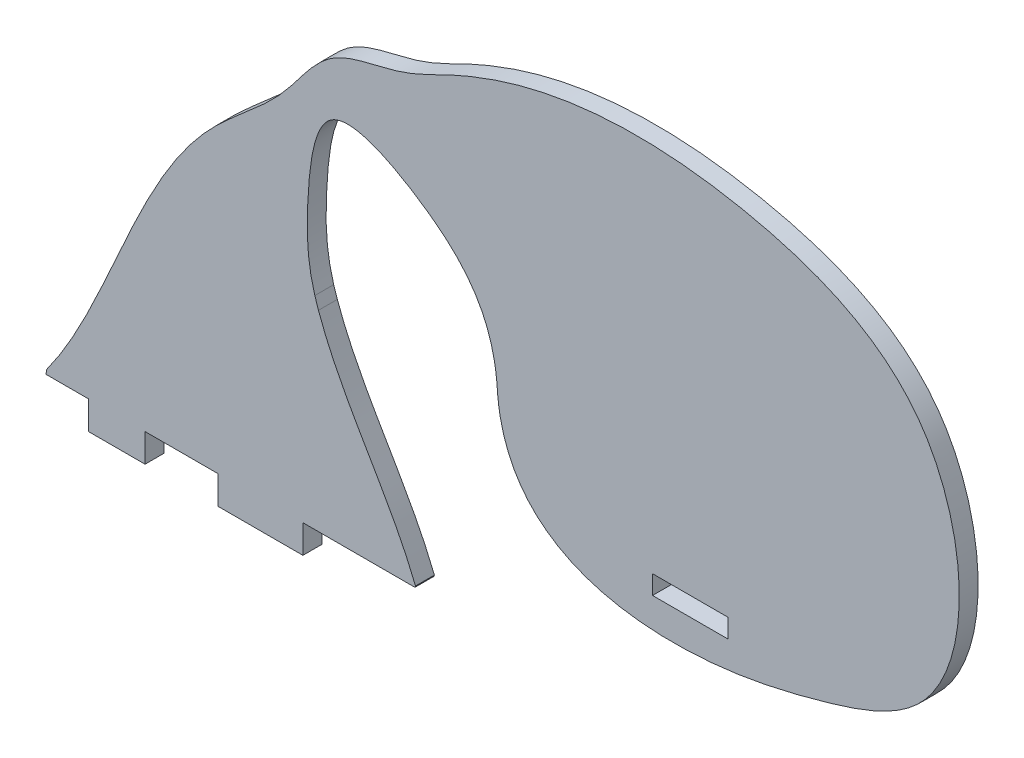
ISO-10303-21;
HEADER;
FILE_DESCRIPTION(('STEP AP214'),'2;1');
FILE_NAME('part.step','',(''),(''),'','','');
FILE_SCHEMA(('AUTOMOTIVE_DESIGN { 1 0 10303 214 1 1 1 1 }'));
ENDSEC;
DATA;
#1=APPLICATION_CONTEXT('core data for automotive mechanical design processes');
#2=APPLICATION_PROTOCOL_DEFINITION('international standard','automotive_design',2000,#1);
#3=PRODUCT_CONTEXT('',#1,'mechanical');
#4=PRODUCT('Part','Part','',(#3));
#5=PRODUCT_RELATED_PRODUCT_CATEGORY('part','',(#4));
#6=PRODUCT_DEFINITION_FORMATION('','',#4);
#7=PRODUCT_DEFINITION_CONTEXT('part definition',#1,'design');
#8=PRODUCT_DEFINITION('design','',#6,#7);
#9=PRODUCT_DEFINITION_SHAPE('','',#8);
#10=(LENGTH_UNIT() NAMED_UNIT(*) SI_UNIT(.MILLI.,.METRE.));
#11=(NAMED_UNIT(*) PLANE_ANGLE_UNIT() SI_UNIT($,.RADIAN.));
#12=(NAMED_UNIT(*) SI_UNIT($,.STERADIAN.) SOLID_ANGLE_UNIT());
#13=UNCERTAINTY_MEASURE_WITH_UNIT(LENGTH_MEASURE(1.E-05),#10,'distance_accuracy_value','');
#14=(GEOMETRIC_REPRESENTATION_CONTEXT(3) GLOBAL_UNCERTAINTY_ASSIGNED_CONTEXT((#13)) GLOBAL_UNIT_ASSIGNED_CONTEXT((#10,
#11,#12)) REPRESENTATION_CONTEXT('',''));
#15=CARTESIAN_POINT('',(0.,0.,0.));
#16=DIRECTION('',(0.,0.,1.));
#17=DIRECTION('',(1.,0.,0.));
#18=AXIS2_PLACEMENT_3D('',#15,#16,#17);
#19=CARTESIAN_POINT('',(151.643041852703,30.245831900639,3.70416970530882));
#20=DIRECTION('',(0.,0.,-1.));
#21=DIRECTION('',(-1.,0.,0.));
#22=AXIS2_PLACEMENT_3D('',#19,#20,#21);
#23=PLANE('',#22);
#24=DIRECTION('',(1.,0.,0.));
#25=VECTOR('',#24,1.);
#26=CARTESIAN_POINT('',(114.448695073066,14.0692116011259,3.70416970530882));
#27=LINE('',#26,#25);
#28=CARTESIAN_POINT('',(114.448695073066,14.0692116011259,3.70416970530882));
#29=VERTEX_POINT('',#28);
#30=CARTESIAN_POINT('',(126.718412539742,14.0692116011259,3.70416970530882));
#31=VERTEX_POINT('',#30);
#32=EDGE_CURVE('E202',#29,#31,#27,.T.);
#33=ORIENTED_EDGE('',*,*,#32,.T.);
#34=DIRECTION('',(0.,-1.,0.));
#35=VECTOR('',#34,1.);
#36=CARTESIAN_POINT('',(126.718412539742,14.0692116011259,3.70416970530882));
#37=LINE('',#36,#35);
#38=CARTESIAN_POINT('',(126.718412539742,9.30671160112593,3.70416970530882));
#39=VERTEX_POINT('',#38);
#40=EDGE_CURVE('E205',#31,#39,#37,.T.);
#41=ORIENTED_EDGE('',*,*,#40,.T.);
#42=DIRECTION('',(1.,0.,0.));
#43=VECTOR('',#42,1.);
#44=CARTESIAN_POINT('',(126.718412539742,9.30671160112593,3.70416970530882));
#45=LINE('',#44,#43);
#46=CARTESIAN_POINT('',(141.005912539742,9.30671160112593,3.70416970530882));
#47=VERTEX_POINT('',#46);
#48=EDGE_CURVE('E208',#39,#47,#45,.T.);
#49=ORIENTED_EDGE('',*,*,#48,.T.);
#50=DIRECTION('',(0.,-1.,0.));
#51=VECTOR('',#50,1.);
#52=CARTESIAN_POINT('',(141.005912539742,14.0692116011253,3.70416970530882));
#53=LINE('',#52,#51);
#54=CARTESIAN_POINT('',(141.005912539742,14.0692116011253,3.70416970530882));
#55=VERTEX_POINT('',#54);
#56=EDGE_CURVE('E210',#55,#47,#53,.T.);
#57=ORIENTED_EDGE('',*,*,#56,.F.);
#58=DIRECTION('',(1.,0.,0.));
#59=VECTOR('',#58,1.);
#60=CARTESIAN_POINT('',(141.005912539742,14.0692116011253,3.70416970530882));
#61=LINE('',#60,#59);
#62=CARTESIAN_POINT('',(159.85715335099,14.0692116011259,3.70416970530882));
#63=VERTEX_POINT('',#62);
#64=EDGE_CURVE('E213',#55,#63,#61,.T.);
#65=ORIENTED_EDGE('',*,*,#64,.T.);
#66=DIRECTION('',(-0.373907961816489,-0.927465813973884,0.));
#67=VECTOR('',#66,1.);
#68=CARTESIAN_POINT('',(159.95759326667,14.3183493506904,3.70416970530882));
#69=LINE('',#68,#67);
#70=CARTESIAN_POINT('',(159.95759326667,14.3183493506904,3.70416970530882));
#71=VERTEX_POINT('',#70);
#72=EDGE_CURVE('E215',#71,#63,#69,.T.);
#73=ORIENTED_EDGE('',*,*,#72,.F.);
#74=CARTESIAN_POINT('',(159.95759326667,14.3183493506904,3.70416970530882));
#75=CARTESIAN_POINT('',(158.650651564647,17.6074449729605,3.70416970530882));
#76=CARTESIAN_POINT('',(155.504316593502,23.777156125624,3.70416970530882));
#77=CARTESIAN_POINT('',(149.323091841887,34.0580293710669,3.70416970530882));
#78=CARTESIAN_POINT('',(145.335663883867,41.5169416765733,3.70416970530882));
#79=CARTESIAN_POINT('',(143.626220332458,46.3267811934756,3.70416970530882));
#80=B_SPLINE_CURVE_WITH_KNOTS('',3,(#74,#75,#76,#77,#78,#79),.UNSPECIFIED.,.F.,.F.,(4,1,1,4),
(0.00717720783399462,0.291773495549775,0.567265053776117,0.97597761351628),.UNSPECIFIED.);
#81=CARTESIAN_POINT('',(143.626220332458,46.3267811934756,3.70416970530882));
#82=VERTEX_POINT('',#81);
#83=EDGE_CURVE('E218',#71,#82,#80,.T.);
#84=ORIENTED_EDGE('',*,*,#83,.T.);
#85=DIRECTION('',(-0.313969115967202,0.949433196290699,0.));
#86=VECTOR('',#85,1.);
#87=CARTESIAN_POINT('',(143.626220332458,46.3267811934756,3.70416970530882));
#88=LINE('',#87,#86);
#89=CARTESIAN_POINT('',(143.016251875612,48.1713075247849,3.70416970530882));
#90=VERTEX_POINT('',#89);
#91=EDGE_CURVE('E223',#82,#90,#88,.T.);
#92=ORIENTED_EDGE('',*,*,#91,.T.);
#93=CARTESIAN_POINT('',(143.016251875612,48.1713075247849,3.70416970530882));
#94=CARTESIAN_POINT('',(142.822162635619,48.8181766287231,3.70416970530882));
#95=CARTESIAN_POINT('',(141.648808489398,53.2496699043366,3.70416970530882));
#96=CARTESIAN_POINT('',(141.5518085589,62.1692172422673,3.70416970530882));
#97=CARTESIAN_POINT('',(143.74990628341,79.9076641607131,3.70416970530882));
#98=CARTESIAN_POINT('',(162.59082079936,70.746647232209,3.70416970530882));
#99=CARTESIAN_POINT('',(171.595089106248,61.790980327002,3.70416970530882));
#100=CARTESIAN_POINT('',(173.420857888494,53.1661321395393,3.70416970530882));
#101=CARTESIAN_POINT('',(173.635098504375,50.9744813258842,3.70416970530882));
#102=B_SPLINE_CURVE_WITH_KNOTS('',3,(#93,#94,#95,#96,#97,#98,#99,#100,#101),.UNSPECIFIED.,.F.,
.F.,(4,1,1,1,1,1,4),(0.264994689383064,0.279802377306264,0.365863399168879,0.45947757732539,
0.562318617098575,0.686929258428295,0.728579137973158),.UNSPECIFIED.);
#103=CARTESIAN_POINT('',(173.635098504375,50.9744813258842,3.70416970530882));
#104=VERTEX_POINT('',#103);
#105=EDGE_CURVE('E565',#90,#104,#102,.T.);
#106=ORIENTED_EDGE('',*,*,#105,.T.);
#107=DIRECTION('',(0.0785114364288763,-0.996913213048094,0.));
#108=VECTOR('',#107,1.);
#109=CARTESIAN_POINT('',(173.635098504375,50.9744813258842,3.70416970530882));
#110=LINE('',#109,#108);
#111=CARTESIAN_POINT('',(173.784835939863,49.0731630630177,3.70416970530882));
#112=VERTEX_POINT('',#111);
#113=EDGE_CURVE('E305',#104,#112,#110,.T.);
#114=ORIENTED_EDGE('',*,*,#113,.T.);
#115=CARTESIAN_POINT('',(97.8805979648672,14.8287965823009,3.70416970530882));
#116=CARTESIAN_POINT('',(103.171392040852,22.0769220326136,3.70416970530882));
#117=CARTESIAN_POINT('',(110.743028890668,40.17936613296,3.70416970530882));
#118=CARTESIAN_POINT('',(121.831282137179,62.5339163119192,3.70416970530882));
#119=CARTESIAN_POINT('',(137.642229051947,73.4604378392573,3.70416970530882));
#120=CARTESIAN_POINT('',(144.896406532219,85.9295711572487,3.70416970530882));
#121=CARTESIAN_POINT('',(156.917499586568,87.0378645227915,3.70416970530882));
#122=CARTESIAN_POINT('',(167.256089322888,92.7135442838898,3.70416970530882));
#123=CARTESIAN_POINT('',(186.423895387685,99.4919003240907,3.70416970530882));
#124=CARTESIAN_POINT('',(215.106199634834,98.923746773354,3.70416970530882));
#125=CARTESIAN_POINT('',(252.420741019095,84.2929110402192,3.70416970530882));
#126=CARTESIAN_POINT('',(254.406057176904,40.0563334543786,3.70416970530882));
#127=CARTESIAN_POINT('',(227.775384830662,31.2343068957348,3.70416970530882));
#128=CARTESIAN_POINT('',(207.822602168201,26.7541932086652,3.70416970530882));
#129=CARTESIAN_POINT('',(183.427343698307,28.4276051629488,3.70416970530882));
#130=CARTESIAN_POINT('',(174.534272798024,40.8262523912298,3.70416970530882));
#131=CARTESIAN_POINT('',(173.784835939863,49.0731630630177,3.70416970530882));
#132=B_SPLINE_CURVE_WITH_KNOTS('',3,(#115,#116,#117,#118,#119,#120,#121,#122,#123,#124,#125,
#126,#127,#128,#129,#130,#131),.UNSPECIFIED.,.F.,.F.,(4,1,1,1,1,1,1,1,1,1,1,1,1,1,4),
(0.00311729559504195,0.0916383178119475,0.183567266396315,0.233931118152205,0.272247454898407,
0.310816901457849,0.339522035367532,0.384499820133369,0.501556462389772,0.607372289843828,
0.734505938126589,0.792568087540492,0.852746693519389,0.93592405260189,0.997824788650368),.UNSPECIFIED.);
#133=CARTESIAN_POINT('',(97.8805979648672,14.8287965823009,3.70416970530882));
#134=VERTEX_POINT('',#133);
#135=EDGE_CURVE('E297',#134,#112,#132,.T.);
#136=ORIENTED_EDGE('',*,*,#135,.F.);
#137=DIRECTION('',(-0.131362101592819,-0.991334453282603,0.));
#138=VECTOR('',#137,1.);
#139=CARTESIAN_POINT('',(97.8805979648672,14.8287965823009,3.70416970530882));
#140=LINE('',#139,#138);
#141=CARTESIAN_POINT('',(97.7799450730656,14.0692116011259,3.70416970530882));
#142=VERTEX_POINT('',#141);
#143=EDGE_CURVE('E304',#134,#142,#140,.T.);
#144=ORIENTED_EDGE('',*,*,#143,.T.);
#145=DIRECTION('',(1.,0.,0.));
#146=VECTOR('',#145,1.);
#147=CARTESIAN_POINT('',(97.7799450730656,14.0692116011259,3.70416970530882));
#148=LINE('',#147,#146);
#149=CARTESIAN_POINT('',(104.923695073066,14.0692116011259,3.70416970530882));
#150=VERTEX_POINT('',#149);
#151=EDGE_CURVE('E310',#142,#150,#148,.T.);
#152=ORIENTED_EDGE('',*,*,#151,.T.);
#153=DIRECTION('',(0.,-1.,0.));
#154=VECTOR('',#153,1.);
#155=CARTESIAN_POINT('',(104.923695073066,14.0692116011259,3.70416970530882));
#156=LINE('',#155,#154);
#157=CARTESIAN_POINT('',(104.923695073066,9.30671160112593,3.70416970530882));
#158=VERTEX_POINT('',#157);
#159=EDGE_CURVE('E312',#150,#158,#156,.T.);
#160=ORIENTED_EDGE('',*,*,#159,.T.);
#161=DIRECTION('',(1.,0.,0.));
#162=VECTOR('',#161,1.);
#163=CARTESIAN_POINT('',(104.923695073066,9.30671160112593,3.70416970530882));
#164=LINE('',#163,#162);
#165=CARTESIAN_POINT('',(114.448695073066,9.30671160112593,3.70416970530882));
#166=VERTEX_POINT('',#165);
#167=EDGE_CURVE('E314',#158,#166,#164,.T.);
#168=ORIENTED_EDGE('',*,*,#167,.T.);
#169=DIRECTION('',(0.,-1.,0.));
#170=VECTOR('',#169,1.);
#171=CARTESIAN_POINT('',(114.448695073066,14.0692116011259,3.70416970530882));
#172=LINE('',#171,#170);
#173=EDGE_CURVE('E316',#29,#166,#172,.T.);
#174=ORIENTED_EDGE('',*,*,#173,.F.);
#175=EDGE_LOOP('',(#33,#41,#49,#57,#65,#73,#84,#92,#106,#114,#136,#144,#152,#160,#168,#174));
#176=FACE_BOUND('',#175,.T.);
#177=DIRECTION('',(0.,1.,0.));
#178=VECTOR('',#177,1.);
#179=CARTESIAN_POINT('',(212.537737342942,32.8767266461979,3.7041697053088));
#180=LINE('',#179,#178);
#181=CARTESIAN_POINT('',(212.537737342942,32.8767266461979,3.7041697053088));
#182=VERTEX_POINT('',#181);
#183=CARTESIAN_POINT('',(212.537737342942,36.0517266461979,3.7041697053088));
#184=VERTEX_POINT('',#183);
#185=EDGE_CURVE('E189',#182,#184,#180,.T.);
#186=ORIENTED_EDGE('',*,*,#185,.F.);
#187=DIRECTION('',(-1.,0.,0.));
#188=VECTOR('',#187,1.);
#189=CARTESIAN_POINT('',(228.412737342942,32.8767266461979,3.7041697053088));
#190=LINE('',#189,#188);
#191=CARTESIAN_POINT('',(199.837737342942,32.8767266461979,3.7041697053088));
#192=VERTEX_POINT('',#191);
#193=EDGE_CURVE('E193',#182,#192,#190,.T.);
#194=ORIENTED_EDGE('',*,*,#193,.T.);
#195=DIRECTION('',(0.,1.,0.));
#196=VECTOR('',#195,1.);
#197=CARTESIAN_POINT('',(199.837737342942,32.8767266461979,3.70416970530882));
#198=LINE('',#197,#196);
#199=CARTESIAN_POINT('',(199.837737342942,36.0517266461979,3.70416970530882));
#200=VERTEX_POINT('',#199);
#201=EDGE_CURVE('E178',#192,#200,#198,.T.);
#202=ORIENTED_EDGE('',*,*,#201,.T.);
#203=DIRECTION('',(-1.,0.,0.));
#204=VECTOR('',#203,1.);
#205=CARTESIAN_POINT('',(228.412737342942,36.0517266461979,3.7041697053088));
#206=LINE('',#205,#204);
#207=EDGE_CURVE('E50',#184,#200,#206,.T.);
#208=ORIENTED_EDGE('',*,*,#207,.F.);
#209=EDGE_LOOP('',(#186,#194,#202,#208));
#210=FACE_BOUND('',#209,.T.);
#211=ADVANCED_FACE('F35',(#176,#210),#23,.F.);
#212=CARTESIAN_POINT('',(114.448695073066,14.0692116011259,3.70416970530882));
#213=DIRECTION('',(0.,1.,0.));
#214=DIRECTION('',(-1.,0.,0.));
#215=AXIS2_PLACEMENT_3D('',#212,#213,#214);
#216=PLANE('',#215);
#217=DIRECTION('',(1.,0.,0.));
#218=VECTOR('',#217,1.);
#219=CARTESIAN_POINT('',(114.448695073066,14.0692116011259,0.529169705308823));
#220=LINE('',#219,#218);
#221=CARTESIAN_POINT('',(114.448695073066,14.0692116011259,0.529169705308823));
#222=VERTEX_POINT('',#221);
#223=CARTESIAN_POINT('',(126.718412539742,14.0692116011259,0.529169705308823));
#224=VERTEX_POINT('',#223);
#225=EDGE_CURVE('E201',#222,#224,#220,.T.);
#226=ORIENTED_EDGE('',*,*,#225,.T.);
#227=DIRECTION('',(0.,0.,-1.));
#228=VECTOR('',#227,1.);
#229=CARTESIAN_POINT('',(126.718412539742,14.0692116011259,3.70416970530882));
#230=LINE('',#229,#228);
#231=EDGE_CURVE('E410',#31,#224,#230,.T.);
#232=ORIENTED_EDGE('',*,*,#231,.F.);
#233=ORIENTED_EDGE('',*,*,#32,.F.);
#234=DIRECTION('',(0.,0.,-1.));
#235=VECTOR('',#234,1.);
#236=CARTESIAN_POINT('',(114.448695073066,14.0692116011259,3.70416970530882));
#237=LINE('',#236,#235);
#238=EDGE_CURVE('E319',#29,#222,#237,.T.);
#239=ORIENTED_EDGE('',*,*,#238,.T.);
#240=EDGE_LOOP('',(#226,#232,#233,#239));
#241=FACE_BOUND('',#240,.T.);
#242=ADVANCED_FACE('F37',(#241),#216,.F.);
#243=CARTESIAN_POINT('',(126.718412539742,14.0692116011259,3.70416970530882));
#244=DIRECTION('',(1.,0.,0.));
#245=DIRECTION('',(0.,0.,-1.));
#246=AXIS2_PLACEMENT_3D('',#243,#244,#245);
#247=PLANE('',#246);
#248=DIRECTION('',(0.,-1.,0.));
#249=VECTOR('',#248,1.);
#250=CARTESIAN_POINT('',(126.718412539742,14.0692116011259,0.529169705308823));
#251=LINE('',#250,#249);
#252=CARTESIAN_POINT('',(126.718412539742,9.30671160112593,0.529169705308823));
#253=VERTEX_POINT('',#252);
#254=EDGE_CURVE('E322',#224,#253,#251,.T.);
#255=ORIENTED_EDGE('',*,*,#254,.T.);
#256=DIRECTION('',(0.,0.,-1.));
#257=VECTOR('',#256,1.);
#258=CARTESIAN_POINT('',(126.718412539742,9.30671160112593,3.70416970530882));
#259=LINE('',#258,#257);
#260=EDGE_CURVE('E407',#39,#253,#259,.T.);
#261=ORIENTED_EDGE('',*,*,#260,.F.);
#262=ORIENTED_EDGE('',*,*,#40,.F.);
#263=ORIENTED_EDGE('',*,*,#231,.T.);
#264=EDGE_LOOP('',(#255,#261,#262,#263));
#265=FACE_BOUND('',#264,.T.);
#266=ADVANCED_FACE('F250',(#265),#247,.F.);
#267=CARTESIAN_POINT('',(126.718412539742,9.30671160112593,3.70416970530882));
#268=DIRECTION('',(0.,1.,0.));
#269=DIRECTION('',(0.,0.,1.));
#270=AXIS2_PLACEMENT_3D('',#267,#268,#269);
#271=PLANE('',#270);
#272=DIRECTION('',(1.,0.,0.));
#273=VECTOR('',#272,1.);
#274=CARTESIAN_POINT('',(126.718412539742,9.30671160112593,0.529169705308823));
#275=LINE('',#274,#273);
#276=CARTESIAN_POINT('',(141.005912539742,9.30671160112593,0.529169705308823));
#277=VERTEX_POINT('',#276);
#278=EDGE_CURVE('E324',#253,#277,#275,.T.);
#279=ORIENTED_EDGE('',*,*,#278,.T.);
#280=DIRECTION('',(0.,0.,-1.));
#281=VECTOR('',#280,1.);
#282=CARTESIAN_POINT('',(141.005912539742,9.30671160112593,3.70416970530882));
#283=LINE('',#282,#281);
#284=EDGE_CURVE('E405',#47,#277,#283,.T.);
#285=ORIENTED_EDGE('',*,*,#284,.F.);
#286=ORIENTED_EDGE('',*,*,#48,.F.);
#287=ORIENTED_EDGE('',*,*,#260,.T.);
#288=EDGE_LOOP('',(#279,#285,#286,#287));
#289=FACE_BOUND('',#288,.T.);
#290=ADVANCED_FACE('F247',(#289),#271,.F.);
#291=CARTESIAN_POINT('',(141.005912539742,14.0692116011253,3.70416970530882));
#292=DIRECTION('',(1.,0.,0.));
#293=DIRECTION('',(0.,0.,-1.));
#294=AXIS2_PLACEMENT_3D('',#291,#292,#293);
#295=PLANE('',#294);
#296=DIRECTION('',(0.,-1.,0.));
#297=VECTOR('',#296,1.);
#298=CARTESIAN_POINT('',(141.005912539742,14.0692116011253,0.529169705308823));
#299=LINE('',#298,#297);
#300=CARTESIAN_POINT('',(141.005912539742,14.0692116011253,0.529169705308823));
#301=VERTEX_POINT('',#300);
#302=EDGE_CURVE('E327',#301,#277,#299,.T.);
#303=ORIENTED_EDGE('',*,*,#302,.F.);
#304=DIRECTION('',(0.,0.,-1.));
#305=VECTOR('',#304,1.);
#306=CARTESIAN_POINT('',(141.005912539742,14.0692116011253,3.70416970530882));
#307=LINE('',#306,#305);
#308=EDGE_CURVE('E403',#55,#301,#307,.T.);
#309=ORIENTED_EDGE('',*,*,#308,.F.);
#310=ORIENTED_EDGE('',*,*,#56,.T.);
#311=ORIENTED_EDGE('',*,*,#284,.T.);
#312=EDGE_LOOP('',(#303,#309,#310,#311));
#313=FACE_BOUND('',#312,.T.);
#314=ADVANCED_FACE('F243',(#313),#295,.T.);
#315=CARTESIAN_POINT('',(141.005912539742,14.0692116011253,3.70416970530882));
#316=DIRECTION('',(0.,1.,0.));
#317=DIRECTION('',(-1.,0.,0.));
#318=AXIS2_PLACEMENT_3D('',#315,#316,#317);
#319=PLANE('',#318);
#320=DIRECTION('',(1.,0.,0.));
#321=VECTOR('',#320,1.);
#322=CARTESIAN_POINT('',(141.005912539742,14.0692116011253,0.529169705308823));
#323=LINE('',#322,#321);
#324=CARTESIAN_POINT('',(159.85715335099,14.0692116011259,0.529169705308823));
#325=VERTEX_POINT('',#324);
#326=EDGE_CURVE('E330',#301,#325,#323,.T.);
#327=ORIENTED_EDGE('',*,*,#326,.T.);
#328=DIRECTION('',(0.,0.,-1.));
#329=VECTOR('',#328,1.);
#330=CARTESIAN_POINT('',(159.85715335099,14.0692116011259,3.70416970530882));
#331=LINE('',#330,#329);
#332=EDGE_CURVE('E401',#63,#325,#331,.T.);
#333=ORIENTED_EDGE('',*,*,#332,.F.);
#334=ORIENTED_EDGE('',*,*,#64,.F.);
#335=ORIENTED_EDGE('',*,*,#308,.T.);
#336=EDGE_LOOP('',(#327,#333,#334,#335));
#337=FACE_BOUND('',#336,.T.);
#338=ADVANCED_FACE('F239',(#337),#319,.F.);
#339=CARTESIAN_POINT('',(159.95759326667,14.3183493506904,3.70416970530882));
#340=DIRECTION('',(0.927465813973884,-0.373907961816489,0.));
#341=DIRECTION('',(0.373907961816489,0.927465813973884,0.));
#342=AXIS2_PLACEMENT_3D('',#339,#340,#341);
#343=PLANE('',#342);
#344=DIRECTION('',(-0.373907961816489,-0.927465813973884,0.));
#345=VECTOR('',#344,1.);
#346=CARTESIAN_POINT('',(159.95759326667,14.3183493506904,0.529169705308823));
#347=LINE('',#346,#345);
#348=CARTESIAN_POINT('',(159.95759326667,14.3183493506904,0.529169705308823));
#349=VERTEX_POINT('',#348);
#350=EDGE_CURVE('E333',#349,#325,#347,.T.);
#351=ORIENTED_EDGE('',*,*,#350,.F.);
#352=DIRECTION('',(0.,0.,-1.));
#353=VECTOR('',#352,1.);
#354=CARTESIAN_POINT('',(159.95759326667,14.3183493506904,3.70416970530882));
#355=LINE('',#354,#353);
#356=EDGE_CURVE('E399',#71,#349,#355,.T.);
#357=ORIENTED_EDGE('',*,*,#356,.F.);
#358=ORIENTED_EDGE('',*,*,#72,.T.);
#359=ORIENTED_EDGE('',*,*,#332,.T.);
#360=EDGE_LOOP('',(#351,#357,#358,#359));
#361=FACE_BOUND('',#360,.T.);
#362=ADVANCED_FACE('F234',(#361),#343,.T.);
#363=DIRECTION('',(0.,0.,-1.));
#364=VECTOR('',#363,1.);
#365=SURFACE_OF_LINEAR_EXTRUSION('',#80,#364);
#366=CARTESIAN_POINT('',(159.95759326667,14.3183493506904,0.529169705308823));
#367=CARTESIAN_POINT('',(158.650651564647,17.6074449729605,0.529169705308823));
#368=CARTESIAN_POINT('',(155.504316593502,23.777156125624,0.529169705308823));
#369=CARTESIAN_POINT('',(149.323091841887,34.0580293710669,0.529169705308823));
#370=CARTESIAN_POINT('',(145.335663883867,41.5169416765733,0.529169705308823));
#371=CARTESIAN_POINT('',(143.626220332458,46.3267811934756,0.529169705308823));
#372=B_SPLINE_CURVE_WITH_KNOTS('',3,(#366,#367,#368,#369,#370,#371),.UNSPECIFIED.,.F.,.F.,(4,1,
1,4),(0.00717720783399462,0.291773495549775,0.567265053776117,0.97597761351628),.UNSPECIFIED.);
#373=CARTESIAN_POINT('',(143.626220332458,46.3267811934756,0.529169705308823));
#374=VERTEX_POINT('',#373);
#375=EDGE_CURVE('E336',#349,#374,#372,.T.);
#376=ORIENTED_EDGE('',*,*,#375,.T.);
#377=DIRECTION('',(0.,0.,-1.));
#378=VECTOR('',#377,1.);
#379=CARTESIAN_POINT('',(143.626220332458,46.3267811934756,3.70416970530882));
#380=LINE('',#379,#378);
#381=EDGE_CURVE('E396',#82,#374,#380,.T.);
#382=ORIENTED_EDGE('',*,*,#381,.F.);
#383=ORIENTED_EDGE('',*,*,#83,.F.);
#384=ORIENTED_EDGE('',*,*,#356,.T.);
#385=EDGE_LOOP('',(#376,#382,#383,#384));
#386=FACE_BOUND('',#385,.T.);
#387=ADVANCED_FACE('F229',(#386),#365,.F.);
#388=CARTESIAN_POINT('',(143.626220332458,46.3267811934756,3.70416970530882));
#389=DIRECTION('',(-0.949433196290699,-0.313969115967202,0.));
#390=DIRECTION('',(0.313969115967202,-0.949433196290699,0.));
#391=AXIS2_PLACEMENT_3D('',#388,#389,#390);
#392=PLANE('',#391);
#393=DIRECTION('',(-0.313969115967202,0.949433196290699,0.));
#394=VECTOR('',#393,1.);
#395=CARTESIAN_POINT('',(143.626220332458,46.3267811934756,0.529169705308823));
#396=LINE('',#395,#394);
#397=CARTESIAN_POINT('',(143.016251875612,48.1713075247849,0.529169705308823));
#398=VERTEX_POINT('',#397);
#399=EDGE_CURVE('E340',#374,#398,#396,.T.);
#400=ORIENTED_EDGE('',*,*,#399,.T.);
#401=DIRECTION('',(0.,0.,-1.));
#402=VECTOR('',#401,1.);
#403=CARTESIAN_POINT('',(143.016251875612,48.1713075247849,3.70416970530882));
#404=LINE('',#403,#402);
#405=EDGE_CURVE('E393',#90,#398,#404,.T.);
#406=ORIENTED_EDGE('',*,*,#405,.F.);
#407=ORIENTED_EDGE('',*,*,#91,.F.);
#408=ORIENTED_EDGE('',*,*,#381,.T.);
#409=EDGE_LOOP('',(#400,#406,#407,#408));
#410=FACE_BOUND('',#409,.T.);
#411=ADVANCED_FACE('F233',(#410),#392,.F.);
#412=DIRECTION('',(0.,0.,-1.));
#413=VECTOR('',#412,1.);
#414=SURFACE_OF_LINEAR_EXTRUSION('',#102,#413);
#415=CARTESIAN_POINT('',(143.016251875612,48.1713075247849,0.529169705308823));
#416=CARTESIAN_POINT('',(142.822162635619,48.8181766287231,0.529169705308823));
#417=CARTESIAN_POINT('',(141.648808489398,53.2496699043366,0.529169705308823));
#418=CARTESIAN_POINT('',(141.5518085589,62.1692172422673,0.529169705308823));
#419=CARTESIAN_POINT('',(143.74990628341,79.9076641607131,0.529169705308823));
#420=CARTESIAN_POINT('',(162.59082079936,70.746647232209,0.529169705308823));
#421=CARTESIAN_POINT('',(171.595089106248,61.790980327002,0.529169705308823));
#422=CARTESIAN_POINT('',(173.420857888494,53.1661321395393,0.529169705308823));
#423=CARTESIAN_POINT('',(173.635098504375,50.9744813258842,0.529169705308823));
#424=B_SPLINE_CURVE_WITH_KNOTS('',3,(#415,#416,#417,#418,#419,#420,#421,#422,#423),
.UNSPECIFIED.,.F.,.F.,(4,1,1,1,1,1,4),(0.264994689383064,0.279802377306264,0.365863399168879,
0.45947757732539,0.562318617098575,0.686929258428295,0.728579137973158),.UNSPECIFIED.);
#425=CARTESIAN_POINT('',(173.635098504375,50.9744813258842,0.529169705308823));
#426=VERTEX_POINT('',#425);
#427=EDGE_CURVE('E345',#398,#426,#424,.T.);
#428=ORIENTED_EDGE('',*,*,#427,.T.);
#429=DIRECTION('',(0.,0.,-1.));
#430=VECTOR('',#429,1.);
#431=CARTESIAN_POINT('',(173.635098504375,50.9744813258842,3.70416970530882));
#432=LINE('',#431,#430);
#433=EDGE_CURVE('E390',#104,#426,#432,.T.);
#434=ORIENTED_EDGE('',*,*,#433,.F.);
#435=ORIENTED_EDGE('',*,*,#105,.F.);
#436=ORIENTED_EDGE('',*,*,#405,.T.);
#437=EDGE_LOOP('',(#428,#434,#435,#436));
#438=FACE_BOUND('',#437,.T.);
#439=ADVANCED_FACE('F492',(#438),#414,.F.);
#440=CARTESIAN_POINT('',(173.635098504375,50.9744813258842,3.70416970530882));
#441=DIRECTION('',(0.996913213048094,0.0785114364288763,0.));
#442=DIRECTION('',(-0.0785114364288763,0.996913213048094,0.));
#443=AXIS2_PLACEMENT_3D('',#440,#441,#442);
#444=PLANE('',#443);
#445=DIRECTION('',(0.0785114364288763,-0.996913213048094,0.));
#446=VECTOR('',#445,1.);
#447=CARTESIAN_POINT('',(173.635098504375,50.9744813258842,0.529169705308823));
#448=LINE('',#447,#446);
#449=CARTESIAN_POINT('',(173.784835939863,49.0731630630177,0.529169705308823));
#450=VERTEX_POINT('',#449);
#451=EDGE_CURVE('E349',#426,#450,#448,.T.);
#452=ORIENTED_EDGE('',*,*,#451,.T.);
#453=DIRECTION('',(0.,0.,-1.));
#454=VECTOR('',#453,1.);
#455=CARTESIAN_POINT('',(173.784835939863,49.0731630630177,3.70416970530882));
#456=LINE('',#455,#454);
#457=EDGE_CURVE('E388',#112,#450,#456,.T.);
#458=ORIENTED_EDGE('',*,*,#457,.F.);
#459=ORIENTED_EDGE('',*,*,#113,.F.);
#460=ORIENTED_EDGE('',*,*,#433,.T.);
#461=EDGE_LOOP('',(#452,#458,#459,#460));
#462=FACE_BOUND('',#461,.T.);
#463=ADVANCED_FACE('F295',(#462),#444,.F.);
#464=DIRECTION('',(0.,0.,-1.));
#465=VECTOR('',#464,1.);
#466=SURFACE_OF_LINEAR_EXTRUSION('',#132,#465);
#467=CARTESIAN_POINT('',(97.8805979648672,14.8287965823009,0.529169705308823));
#468=CARTESIAN_POINT('',(103.171392040852,22.0769220326136,0.529169705308823));
#469=CARTESIAN_POINT('',(110.743028890668,40.17936613296,0.529169705308823));
#470=CARTESIAN_POINT('',(121.831282137179,62.5339163119192,0.529169705308823));
#471=CARTESIAN_POINT('',(137.642229051947,73.4604378392573,0.529169705308823));
#472=CARTESIAN_POINT('',(144.896406532219,85.9295711572487,0.529169705308823));
#473=CARTESIAN_POINT('',(156.917499586568,87.0378645227915,0.529169705308823));
#474=CARTESIAN_POINT('',(167.256089322888,92.7135442838898,0.529169705308823));
#475=CARTESIAN_POINT('',(186.423895387685,99.4919003240907,0.529169705308823));
#476=CARTESIAN_POINT('',(215.106199634834,98.923746773354,0.529169705308823));
#477=CARTESIAN_POINT('',(252.420741019095,84.2929110402192,0.529169705308823));
#478=CARTESIAN_POINT('',(254.406057176904,40.0563334543786,0.529169705308823));
#479=CARTESIAN_POINT('',(227.775384830662,31.2343068957348,0.529169705308823));
#480=CARTESIAN_POINT('',(207.822602168201,26.7541932086652,0.529169705308823));
#481=CARTESIAN_POINT('',(183.427343698307,28.4276051629488,0.529169705308823));
#482=CARTESIAN_POINT('',(174.534272798024,40.8262523912298,0.529169705308823));
#483=CARTESIAN_POINT('',(173.784835939863,49.0731630630177,0.529169705308823));
#484=B_SPLINE_CURVE_WITH_KNOTS('',3,(#467,#468,#469,#470,#471,#472,#473,#474,#475,#476,#477,
#478,#479,#480,#481,#482,#483),.UNSPECIFIED.,.F.,.F.,(4,1,1,1,1,1,1,1,1,1,1,1,1,1,4),
(0.00311729559504195,0.0916383178119475,0.183567266396315,0.233931118152205,0.272247454898407,
0.310816901457849,0.339522035367532,0.384499820133369,0.501556462389772,0.607372289843828,
0.734505938126589,0.792568087540492,0.852746693519389,0.93592405260189,0.997824788650368),.UNSPECIFIED.);
#485=CARTESIAN_POINT('',(97.8805979648672,14.8287965823009,0.529169705308823));
#486=VERTEX_POINT('',#485);
#487=EDGE_CURVE('E355',#486,#450,#484,.T.);
#488=ORIENTED_EDGE('',*,*,#487,.F.);
#489=DIRECTION('',(0.,0.,-1.));
#490=VECTOR('',#489,1.);
#491=CARTESIAN_POINT('',(97.8805979648672,14.8287965823009,3.70416970530882));
#492=LINE('',#491,#490);
#493=EDGE_CURVE('E386',#134,#486,#492,.T.);
#494=ORIENTED_EDGE('',*,*,#493,.F.);
#495=ORIENTED_EDGE('',*,*,#135,.T.);
#496=ORIENTED_EDGE('',*,*,#457,.T.);
#497=EDGE_LOOP('',(#488,#494,#495,#496));
#498=FACE_BOUND('',#497,.T.);
#499=ADVANCED_FACE('F290',(#498),#466,.T.);
#500=CARTESIAN_POINT('',(97.8805979648672,14.8287965823009,3.70416970530882));
#501=DIRECTION('',(0.991334453282603,-0.131362101592819,0.));
#502=DIRECTION('',(0.131362101592819,0.991334453282603,0.));
#503=AXIS2_PLACEMENT_3D('',#500,#501,#502);
#504=PLANE('',#503);
#505=DIRECTION('',(-0.131362101592819,-0.991334453282603,0.));
#506=VECTOR('',#505,1.);
#507=CARTESIAN_POINT('',(97.8805979648672,14.8287965823009,0.529169705308823));
#508=LINE('',#507,#506);
#509=CARTESIAN_POINT('',(97.7799450730656,14.0692116011259,0.529169705308823));
#510=VERTEX_POINT('',#509);
#511=EDGE_CURVE('E360',#486,#510,#508,.T.);
#512=ORIENTED_EDGE('',*,*,#511,.T.);
#513=DIRECTION('',(0.,0.,-1.));
#514=VECTOR('',#513,1.);
#515=CARTESIAN_POINT('',(97.7799450730656,14.0692116011259,3.70416970530882));
#516=LINE('',#515,#514);
#517=EDGE_CURVE('E383',#142,#510,#516,.T.);
#518=ORIENTED_EDGE('',*,*,#517,.F.);
#519=ORIENTED_EDGE('',*,*,#143,.F.);
#520=ORIENTED_EDGE('',*,*,#493,.T.);
#521=EDGE_LOOP('',(#512,#518,#519,#520));
#522=FACE_BOUND('',#521,.T.);
#523=ADVANCED_FACE('F286',(#522),#504,.F.);
#524=CARTESIAN_POINT('',(97.7799450730656,14.0692116011259,3.70416970530882));
#525=DIRECTION('',(0.,1.,0.));
#526=DIRECTION('',(-1.,0.,0.));
#527=AXIS2_PLACEMENT_3D('',#524,#525,#526);
#528=PLANE('',#527);
#529=DIRECTION('',(1.,0.,0.));
#530=VECTOR('',#529,1.);
#531=CARTESIAN_POINT('',(97.7799450730656,14.0692116011259,0.529169705308823));
#532=LINE('',#531,#530);
#533=CARTESIAN_POINT('',(104.923695073066,14.0692116011259,0.529169705308823));
#534=VERTEX_POINT('',#533);
#535=EDGE_CURVE('E365',#510,#534,#532,.T.);
#536=ORIENTED_EDGE('',*,*,#535,.T.);
#537=DIRECTION('',(0.,0.,-1.));
#538=VECTOR('',#537,1.);
#539=CARTESIAN_POINT('',(104.923695073066,14.0692116011259,3.70416970530882));
#540=LINE('',#539,#538);
#541=EDGE_CURVE('E380',#150,#534,#540,.T.);
#542=ORIENTED_EDGE('',*,*,#541,.F.);
#543=ORIENTED_EDGE('',*,*,#151,.F.);
#544=ORIENTED_EDGE('',*,*,#517,.T.);
#545=EDGE_LOOP('',(#536,#542,#543,#544));
#546=FACE_BOUND('',#545,.T.);
#547=ADVANCED_FACE('F282',(#546),#528,.F.);
#548=CARTESIAN_POINT('',(104.923695073066,14.0692116011259,3.70416970530882));
#549=DIRECTION('',(1.,0.,0.));
#550=DIRECTION('',(0.,0.,-1.));
#551=AXIS2_PLACEMENT_3D('',#548,#549,#550);
#552=PLANE('',#551);
#553=DIRECTION('',(0.,-1.,0.));
#554=VECTOR('',#553,1.);
#555=CARTESIAN_POINT('',(104.923695073066,14.0692116011259,0.529169705308823));
#556=LINE('',#555,#554);
#557=CARTESIAN_POINT('',(104.923695073066,9.30671160112593,0.529169705308823));
#558=VERTEX_POINT('',#557);
#559=EDGE_CURVE('E367',#534,#558,#556,.T.);
#560=ORIENTED_EDGE('',*,*,#559,.T.);
#561=DIRECTION('',(0.,0.,-1.));
#562=VECTOR('',#561,1.);
#563=CARTESIAN_POINT('',(104.923695073066,9.30671160112593,3.70416970530882));
#564=LINE('',#563,#562);
#565=EDGE_CURVE('E377',#158,#558,#564,.T.);
#566=ORIENTED_EDGE('',*,*,#565,.F.);
#567=ORIENTED_EDGE('',*,*,#159,.F.);
#568=ORIENTED_EDGE('',*,*,#541,.T.);
#569=EDGE_LOOP('',(#560,#566,#567,#568));
#570=FACE_BOUND('',#569,.T.);
#571=ADVANCED_FACE('F278',(#570),#552,.F.);
#572=CARTESIAN_POINT('',(104.923695073066,9.30671160112593,3.70416970530882));
#573=DIRECTION('',(0.,1.,0.));
#574=DIRECTION('',(0.,0.,1.));
#575=AXIS2_PLACEMENT_3D('',#572,#573,#574);
#576=PLANE('',#575);
#577=DIRECTION('',(1.,0.,0.));
#578=VECTOR('',#577,1.);
#579=CARTESIAN_POINT('',(104.923695073066,9.30671160112593,0.529169705308823));
#580=LINE('',#579,#578);
#581=CARTESIAN_POINT('',(114.448695073066,9.30671160112593,0.529169705308823));
#582=VERTEX_POINT('',#581);
#583=EDGE_CURVE('E369',#558,#582,#580,.T.);
#584=ORIENTED_EDGE('',*,*,#583,.T.);
#585=DIRECTION('',(0.,0.,-1.));
#586=VECTOR('',#585,1.);
#587=CARTESIAN_POINT('',(114.448695073066,9.30671160112593,3.70416970530882));
#588=LINE('',#587,#586);
#589=EDGE_CURVE('E375',#166,#582,#588,.T.);
#590=ORIENTED_EDGE('',*,*,#589,.F.);
#591=ORIENTED_EDGE('',*,*,#167,.F.);
#592=ORIENTED_EDGE('',*,*,#565,.T.);
#593=EDGE_LOOP('',(#584,#590,#591,#592));
#594=FACE_BOUND('',#593,.T.);
#595=ADVANCED_FACE('F274',(#594),#576,.F.);
#596=CARTESIAN_POINT('',(114.448695073066,14.0692116011259,3.70416970530882));
#597=DIRECTION('',(1.,0.,0.));
#598=DIRECTION('',(0.,0.,-1.));
#599=AXIS2_PLACEMENT_3D('',#596,#597,#598);
#600=PLANE('',#599);
#601=DIRECTION('',(0.,-1.,0.));
#602=VECTOR('',#601,1.);
#603=CARTESIAN_POINT('',(114.448695073066,14.0692116011259,0.529169705308823));
#604=LINE('',#603,#602);
#605=EDGE_CURVE('E206',#222,#582,#604,.T.);
#606=ORIENTED_EDGE('',*,*,#605,.F.);
#607=ORIENTED_EDGE('',*,*,#238,.F.);
#608=ORIENTED_EDGE('',*,*,#173,.T.);
#609=ORIENTED_EDGE('',*,*,#589,.T.);
#610=EDGE_LOOP('',(#606,#607,#608,#609));
#611=FACE_BOUND('',#610,.T.);
#612=ADVANCED_FACE('F271',(#611),#600,.T.);
#613=CARTESIAN_POINT('',(151.643041852703,30.245831900639,0.529169705308823));
#614=DIRECTION('',(0.,0.,-1.));
#615=DIRECTION('',(-1.,0.,0.));
#616=AXIS2_PLACEMENT_3D('',#613,#614,#615);
#617=PLANE('',#616);
#618=DIRECTION('',(0.,1.,0.));
#619=VECTOR('',#618,1.);
#620=CARTESIAN_POINT('',(212.537737342942,32.8767266461979,0.529169705273683));
#621=LINE('',#620,#619);
#622=CARTESIAN_POINT('',(212.537737342942,32.8767266461979,0.529169705273683));
#623=VERTEX_POINT('',#622);
#624=CARTESIAN_POINT('',(212.537737342942,36.0517266461979,0.529169705273683));
#625=VERTEX_POINT('',#624);
#626=EDGE_CURVE('E186',#623,#625,#621,.T.);
#627=ORIENTED_EDGE('',*,*,#626,.T.);
#628=DIRECTION('',(-1.,0.,0.));
#629=VECTOR('',#628,1.);
#630=CARTESIAN_POINT('',(151.643041852703,36.0517266461979,0.529169705308823));
#631=LINE('',#630,#629);
#632=CARTESIAN_POINT('',(199.837737342942,36.0517266461979,0.529169705273655));
#633=VERTEX_POINT('',#632);
#634=EDGE_CURVE('E11',#625,#633,#631,.T.);
#635=ORIENTED_EDGE('',*,*,#634,.T.);
#636=DIRECTION('',(0.,1.,0.));
#637=VECTOR('',#636,1.);
#638=CARTESIAN_POINT('',(199.837737342942,32.8767266461979,0.529169705273655));
#639=LINE('',#638,#637);
#640=CARTESIAN_POINT('',(199.837737342942,32.8767266461979,0.529169705308823));
#641=VERTEX_POINT('',#640);
#642=EDGE_CURVE('E171',#641,#633,#639,.T.);
#643=ORIENTED_EDGE('',*,*,#642,.F.);
#644=DIRECTION('',(-1.,0.,0.));
#645=VECTOR('',#644,1.);
#646=CARTESIAN_POINT('',(151.643041852703,32.8767266461979,0.529169705308823));
#647=LINE('',#646,#645);
#648=EDGE_CURVE('E43',#623,#641,#647,.T.);
#649=ORIENTED_EDGE('',*,*,#648,.F.);
#650=EDGE_LOOP('',(#627,#635,#643,#649));
#651=FACE_BOUND('',#650,.T.);
#652=ORIENTED_EDGE('',*,*,#225,.F.);
#653=ORIENTED_EDGE('',*,*,#605,.T.);
#654=ORIENTED_EDGE('',*,*,#583,.F.);
#655=ORIENTED_EDGE('',*,*,#559,.F.);
#656=ORIENTED_EDGE('',*,*,#535,.F.);
#657=ORIENTED_EDGE('',*,*,#511,.F.);
#658=ORIENTED_EDGE('',*,*,#487,.T.);
#659=ORIENTED_EDGE('',*,*,#451,.F.);
#660=ORIENTED_EDGE('',*,*,#427,.F.);
#661=ORIENTED_EDGE('',*,*,#399,.F.);
#662=ORIENTED_EDGE('',*,*,#375,.F.);
#663=ORIENTED_EDGE('',*,*,#350,.T.);
#664=ORIENTED_EDGE('',*,*,#326,.F.);
#665=ORIENTED_EDGE('',*,*,#302,.T.);
#666=ORIENTED_EDGE('',*,*,#278,.F.);
#667=ORIENTED_EDGE('',*,*,#254,.F.);
#668=EDGE_LOOP('',(#652,#653,#654,#655,#656,#657,#658,#659,#660,#661,#662,#663,#664,#665,#666,#667));
#669=FACE_BOUND('',#668,.T.);
#670=ADVANCED_FACE('F184',(#651,#669),#617,.T.);
#671=CARTESIAN_POINT('',(228.412737342942,36.0517266461979,3.7041697053088));
#672=DIRECTION('',(0.,-1.,0.));
#673=DIRECTION('',(0.,0.,1.));
#674=AXIS2_PLACEMENT_3D('',#671,#672,#673);
#675=PLANE('',#674);
#676=DIRECTION('',(0.,0.,1.));
#677=VECTOR('',#676,1.);
#678=CARTESIAN_POINT('',(212.537737342942,36.0517266461979,3.7041697053088));
#679=LINE('',#678,#677);
#680=EDGE_CURVE('E177',#625,#184,#679,.T.);
#681=ORIENTED_EDGE('',*,*,#680,.T.);
#682=ORIENTED_EDGE('',*,*,#207,.T.);
#683=DIRECTION('',(0.,0.,-1.));
#684=VECTOR('',#683,1.);
#685=CARTESIAN_POINT('',(199.837737342942,36.0517266461979,3.70416970530882));
#686=LINE('',#685,#684);
#687=EDGE_CURVE('E173',#200,#633,#686,.T.);
#688=ORIENTED_EDGE('',*,*,#687,.T.);
#689=ORIENTED_EDGE('',*,*,#634,.F.);
#690=EDGE_LOOP('',(#681,#682,#688,#689));
#691=FACE_BOUND('',#690,.T.);
#692=ADVANCED_FACE('F180',(#691),#675,.T.);
#693=CARTESIAN_POINT('',(228.412737342942,32.8767266461979,3.7041697053088));
#694=DIRECTION('',(0.,-1.,0.));
#695=DIRECTION('',(0.,0.,1.));
#696=AXIS2_PLACEMENT_3D('',#693,#694,#695);
#697=PLANE('',#696);
#698=ORIENTED_EDGE('',*,*,#648,.T.);
#699=DIRECTION('',(0.,0.,-1.));
#700=VECTOR('',#699,1.);
#701=CARTESIAN_POINT('',(199.837737342942,32.8767266461979,3.70416970530882));
#702=LINE('',#701,#700);
#703=EDGE_CURVE('E58',#192,#641,#702,.T.);
#704=ORIENTED_EDGE('',*,*,#703,.F.);
#705=ORIENTED_EDGE('',*,*,#193,.F.);
#706=DIRECTION('',(0.,0.,1.));
#707=VECTOR('',#706,1.);
#708=CARTESIAN_POINT('',(212.537737342942,32.8767266461979,3.7041697053088));
#709=LINE('',#708,#707);
#710=EDGE_CURVE('E190',#623,#182,#709,.T.);
#711=ORIENTED_EDGE('',*,*,#710,.F.);
#712=EDGE_LOOP('',(#698,#704,#705,#711));
#713=FACE_BOUND('',#712,.T.);
#714=ADVANCED_FACE('F268',(#713),#697,.F.);
#715=CARTESIAN_POINT('',(212.537737342942,32.8767266461979,3.7041697053088));
#716=DIRECTION('',(-1.,0.,0.));
#717=DIRECTION('',(0.,0.,1.));
#718=AXIS2_PLACEMENT_3D('',#715,#716,#717);
#719=PLANE('',#718);
#720=ORIENTED_EDGE('',*,*,#680,.F.);
#721=ORIENTED_EDGE('',*,*,#626,.F.);
#722=ORIENTED_EDGE('',*,*,#710,.T.);
#723=ORIENTED_EDGE('',*,*,#185,.T.);
#724=EDGE_LOOP('',(#720,#721,#722,#723));
#725=FACE_BOUND('',#724,.T.);
#726=ADVANCED_FACE('F415',(#725),#719,.T.);
#727=CARTESIAN_POINT('',(199.837737342942,32.8767266461979,3.70416970530882));
#728=DIRECTION('',(1.,0.,0.));
#729=DIRECTION('',(0.,0.,-1.));
#730=AXIS2_PLACEMENT_3D('',#727,#728,#729);
#731=PLANE('',#730);
#732=ORIENTED_EDGE('',*,*,#687,.F.);
#733=ORIENTED_EDGE('',*,*,#201,.F.);
#734=ORIENTED_EDGE('',*,*,#703,.T.);
#735=ORIENTED_EDGE('',*,*,#642,.T.);
#736=EDGE_LOOP('',(#732,#733,#734,#735));
#737=FACE_BOUND('',#736,.T.);
#738=ADVANCED_FACE('F172',(#737),#731,.T.);
#739=CLOSED_SHELL('',(#211,#242,#266,#290,#314,#338,#362,#387,#411,#439,#463,#499,#523,#547,
#571,#595,#612,#670,#692,#714,#726,#738));
#740=MANIFOLD_SOLID_BREP('B2',#739);
#741=ADVANCED_BREP_SHAPE_REPRESENTATION('',(#18,#740),#14);
#742=SHAPE_DEFINITION_REPRESENTATION(#9,#741);
ENDSEC;
END-ISO-10303-21;
